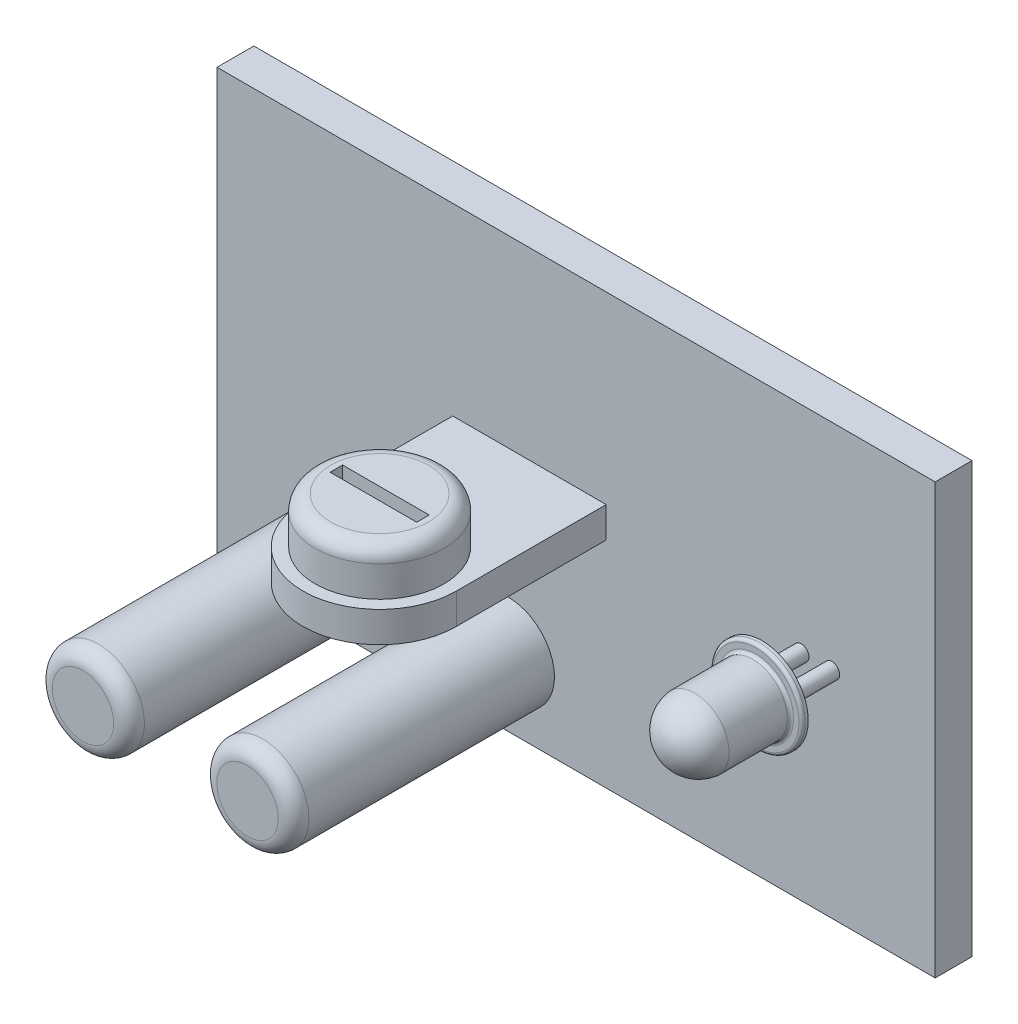
ISO-10303-21;
HEADER;
FILE_DESCRIPTION(('STEP AP214'),'2;1');
FILE_NAME('part.step','',(''),(''),'','','');
FILE_SCHEMA(('AUTOMOTIVE_DESIGN { 1 0 10303 214 1 1 1 1 }'));
ENDSEC;
DATA;
#1=APPLICATION_CONTEXT('core data for automotive mechanical design processes');
#2=APPLICATION_PROTOCOL_DEFINITION('international standard','automotive_design',2000,#1);
#3=PRODUCT_CONTEXT('',#1,'mechanical');
#4=PRODUCT('Part','Part','',(#3));
#5=PRODUCT_RELATED_PRODUCT_CATEGORY('part','',(#4));
#6=PRODUCT_DEFINITION_FORMATION('','',#4);
#7=PRODUCT_DEFINITION_CONTEXT('part definition',#1,'design');
#8=PRODUCT_DEFINITION('design','',#6,#7);
#9=PRODUCT_DEFINITION_SHAPE('','',#8);
#10=(LENGTH_UNIT() NAMED_UNIT(*) SI_UNIT(.MILLI.,.METRE.));
#11=(NAMED_UNIT(*) PLANE_ANGLE_UNIT() SI_UNIT($,.RADIAN.));
#12=(NAMED_UNIT(*) SI_UNIT($,.STERADIAN.) SOLID_ANGLE_UNIT());
#13=UNCERTAINTY_MEASURE_WITH_UNIT(LENGTH_MEASURE(1.E-05),#10,'distance_accuracy_value','');
#14=(GEOMETRIC_REPRESENTATION_CONTEXT(3) GLOBAL_UNCERTAINTY_ASSIGNED_CONTEXT((#13)) GLOBAL_UNIT_ASSIGNED_CONTEXT((#10,
#11,#12)) REPRESENTATION_CONTEXT('',''));
#15=CARTESIAN_POINT('',(0.,0.,0.));
#16=DIRECTION('',(0.,0.,1.));
#17=DIRECTION('',(1.,0.,0.));
#18=AXIS2_PLACEMENT_3D('',#15,#16,#17);
#19=CARTESIAN_POINT('',(0.,14.,1.2));
#20=DIRECTION('',(0.,0.,-1.));
#21=DIRECTION('',(-1.,0.,0.));
#22=AXIS2_PLACEMENT_3D('',#19,#20,#21);
#23=PLANE('',#22);
#24=CARTESIAN_POINT('',(4.13384348840779,2.29242224592477,1.2));
#25=DIRECTION('',(0.,0.,-1.));
#26=DIRECTION('',(-1.,0.,0.));
#27=AXIS2_PLACEMENT_3D('',#24,#25,#26);
#28=CIRCLE('',#27,1.5);
#29=CARTESIAN_POINT('',(2.63384348840779,2.29242224592477,1.2));
#30=VERTEX_POINT('',#29);
#31=EDGE_CURVE('E262',#30,#30,#28,.F.);
#32=ORIENTED_EDGE('',*,*,#31,.F.);
#33=EDGE_LOOP('',(#32));
#34=FACE_BOUND('',#33,.T.);
#35=CARTESIAN_POINT('',(19.0373188078302,7.,1.2));
#36=DIRECTION('',(0.,0.,-1.));
#37=DIRECTION('',(-1.,0.,0.));
#38=AXIS2_PLACEMENT_3D('',#35,#36,#37);
#39=CIRCLE('',#38,0.25);
#40=CARTESIAN_POINT('',(18.7873188078302,7.,1.2));
#41=VERTEX_POINT('',#40);
#42=EDGE_CURVE('E235',#41,#41,#39,.F.);
#43=ORIENTED_EDGE('',*,*,#42,.F.);
#44=EDGE_LOOP('',(#43));
#45=FACE_BOUND('',#44,.T.);
#46=DIRECTION('',(0.,-1.,0.));
#47=VECTOR('',#46,1.);
#48=CARTESIAN_POINT('',(0.,0.,1.2));
#49=LINE('',#48,#47);
#50=CARTESIAN_POINT('',(0.,14.,1.2));
#51=VERTEX_POINT('',#50);
#52=CARTESIAN_POINT('',(0.,0.,1.2));
#53=VERTEX_POINT('',#52);
#54=EDGE_CURVE('E203',#51,#53,#49,.T.);
#55=ORIENTED_EDGE('',*,*,#54,.T.);
#56=DIRECTION('',(1.,0.,0.));
#57=VECTOR('',#56,1.);
#58=CARTESIAN_POINT('',(0.,0.,1.2));
#59=LINE('',#58,#57);
#60=CARTESIAN_POINT('',(23.4,0.,1.2));
#61=VERTEX_POINT('',#60);
#62=EDGE_CURVE('E206',#53,#61,#59,.T.);
#63=ORIENTED_EDGE('',*,*,#62,.T.);
#64=DIRECTION('',(0.,1.,0.));
#65=VECTOR('',#64,1.);
#66=CARTESIAN_POINT('',(23.4,0.,1.2));
#67=LINE('',#66,#65);
#68=CARTESIAN_POINT('',(23.4,14.,1.2));
#69=VERTEX_POINT('',#68);
#70=EDGE_CURVE('E209',#61,#69,#67,.T.);
#71=ORIENTED_EDGE('',*,*,#70,.T.);
#72=DIRECTION('',(-1.,0.,0.));
#73=VECTOR('',#72,1.);
#74=CARTESIAN_POINT('',(0.,14.,1.2));
#75=LINE('',#74,#73);
#76=EDGE_CURVE('E211',#69,#51,#75,.T.);
#77=ORIENTED_EDGE('',*,*,#76,.T.);
#78=EDGE_LOOP('',(#55,#63,#71,#77));
#79=FACE_BOUND('',#78,.T.);
#80=CARTESIAN_POINT('',(20.0373188078302,7.,1.2));
#81=DIRECTION('',(0.,0.,-1.));
#82=DIRECTION('',(-1.,0.,0.));
#83=AXIS2_PLACEMENT_3D('',#80,#81,#82);
#84=CIRCLE('',#83,0.25);
#85=CARTESIAN_POINT('',(19.7873188078302,7.,1.2));
#86=VERTEX_POINT('',#85);
#87=EDGE_CURVE('E232',#86,#86,#84,.F.);
#88=ORIENTED_EDGE('',*,*,#87,.F.);
#89=EDGE_LOOP('',(#88));
#90=FACE_BOUND('',#89,.T.);
#91=DIRECTION('',(-1.,0.,0.));
#92=VECTOR('',#91,1.);
#93=CARTESIAN_POINT('',(12.6798034481771,8.,1.2));
#94=LINE('',#93,#92);
#95=CARTESIAN_POINT('',(12.6798034481771,8.,1.2));
#96=VERTEX_POINT('',#95);
#97=CARTESIAN_POINT('',(7.67980344817706,8.,1.2));
#98=VERTEX_POINT('',#97);
#99=EDGE_CURVE('E166',#96,#98,#94,.T.);
#100=ORIENTED_EDGE('',*,*,#99,.F.);
#101=DIRECTION('',(0.,-1.,0.));
#102=VECTOR('',#101,1.);
#103=CARTESIAN_POINT('',(12.6798034481771,8.,1.2));
#104=LINE('',#103,#102);
#105=CARTESIAN_POINT('',(12.6798034481771,7.,1.2));
#106=VERTEX_POINT('',#105);
#107=EDGE_CURVE('E176',#96,#106,#104,.T.);
#108=ORIENTED_EDGE('',*,*,#107,.T.);
#109=DIRECTION('',(-1.,0.,0.));
#110=VECTOR('',#109,1.);
#111=CARTESIAN_POINT('',(12.6798034481771,7.,1.2));
#112=LINE('',#111,#110);
#113=CARTESIAN_POINT('',(7.67980344817706,7.,1.2));
#114=VERTEX_POINT('',#113);
#115=EDGE_CURVE('E162',#106,#114,#112,.T.);
#116=ORIENTED_EDGE('',*,*,#115,.T.);
#117=DIRECTION('',(0.,-1.,0.));
#118=VECTOR('',#117,1.);
#119=CARTESIAN_POINT('',(7.67980344817706,8.,1.2));
#120=LINE('',#119,#118);
#121=EDGE_CURVE('E61',#98,#114,#120,.T.);
#122=ORIENTED_EDGE('',*,*,#121,.F.);
#123=EDGE_LOOP('',(#100,#108,#116,#122));
#124=FACE_BOUND('',#123,.T.);
#125=CARTESIAN_POINT('',(9.49280276463912,2.29242224592477,1.2));
#126=DIRECTION('',(0.,0.,-1.));
#127=DIRECTION('',(-1.,0.,0.));
#128=AXIS2_PLACEMENT_3D('',#125,#126,#127);
#129=CIRCLE('',#128,1.5);
#130=CARTESIAN_POINT('',(7.99280276463912,2.29242224592477,1.2));
#131=VERTEX_POINT('',#130);
#132=EDGE_CURVE('E265',#131,#131,#129,.F.);
#133=ORIENTED_EDGE('',*,*,#132,.F.);
#134=EDGE_LOOP('',(#133));
#135=FACE_BOUND('',#134,.T.);
#136=ADVANCED_FACE('F38',(#34,#45,#79,#90,#124,#135),#23,.F.);
#137=CARTESIAN_POINT('',(10.1798034481771,8.,6.08140192088163));
#138=DIRECTION('',(0.,-1.,0.));
#139=DIRECTION('',(0.,0.,-1.));
#140=AXIS2_PLACEMENT_3D('',#137,#138,#139);
#141=PLANE('',#140);
#142=ORIENTED_EDGE('',*,*,#99,.T.);
#143=DIRECTION('',(0.,0.,1.));
#144=VECTOR('',#143,1.);
#145=CARTESIAN_POINT('',(7.67980344817706,8.,1.2));
#146=LINE('',#145,#144);
#147=CARTESIAN_POINT('',(7.67980344817706,8.,6.08140192088163));
#148=VERTEX_POINT('',#147);
#149=EDGE_CURVE('E169',#98,#148,#146,.T.);
#150=ORIENTED_EDGE('',*,*,#149,.T.);
#151=CARTESIAN_POINT('',(10.1798034481771,8.,6.08140192088163));
#152=DIRECTION('',(0.,1.,0.));
#153=DIRECTION('',(0.,0.,-1.));
#154=AXIS2_PLACEMENT_3D('',#151,#152,#153);
#155=CIRCLE('',#154,2.5);
#156=CARTESIAN_POINT('',(12.6798034481771,8.,6.08140192088163));
#157=VERTEX_POINT('',#156);
#158=EDGE_CURVE('E172',#148,#157,#155,.T.);
#159=ORIENTED_EDGE('',*,*,#158,.T.);
#160=DIRECTION('',(0.,0.,-1.));
#161=VECTOR('',#160,1.);
#162=CARTESIAN_POINT('',(12.6798034481771,8.,1.2));
#163=LINE('',#162,#161);
#164=EDGE_CURVE('E174',#157,#96,#163,.T.);
#165=ORIENTED_EDGE('',*,*,#164,.T.);
#166=EDGE_LOOP('',(#142,#150,#159,#165));
#167=FACE_BOUND('',#166,.T.);
#168=CARTESIAN_POINT('',(10.1798034481771,8.,6.08140192088163));
#169=DIRECTION('',(0.,-1.,0.));
#170=DIRECTION('',(0.,0.,-1.));
#171=AXIS2_PLACEMENT_3D('',#168,#169,#170);
#172=CIRCLE('',#171,2.09861460217062);
#173=CARTESIAN_POINT('',(10.1798034481771,8.,3.98278731871101));
#174=VERTEX_POINT('',#173);
#175=EDGE_CURVE('E253',#174,#174,#172,.F.);
#176=ORIENTED_EDGE('',*,*,#175,.F.);
#177=EDGE_LOOP('',(#176));
#178=FACE_BOUND('',#177,.T.);
#179=ADVANCED_FACE('F287',(#167,#178),#141,.F.);
#180=CARTESIAN_POINT('',(20.0373188078302,7.,3.2));
#181=DIRECTION('',(0.,0.,1.));
#182=DIRECTION('',(1.,0.,0.));
#183=AXIS2_PLACEMENT_3D('',#180,#181,#182);
#184=PLANE('',#183);
#185=CARTESIAN_POINT('',(19.5633125136962,7.,3.2));
#186=DIRECTION('',(0.,0.,1.));
#187=DIRECTION('',(1.,0.,0.));
#188=AXIS2_PLACEMENT_3D('',#185,#186,#187);
#189=CIRCLE('',#188,1.22176659636533);
#190=CARTESIAN_POINT('',(20.7850791100615,7.,3.2));
#191=VERTEX_POINT('',#190);
#192=EDGE_CURVE('E247',#191,#191,#189,.F.);
#193=ORIENTED_EDGE('',*,*,#192,.T.);
#194=EDGE_LOOP('',(#193));
#195=FACE_BOUND('',#194,.T.);
#196=CARTESIAN_POINT('',(19.5633125136962,7.,3.2));
#197=DIRECTION('',(0.,0.,1.));
#198=DIRECTION('',(1.,0.,0.));
#199=AXIS2_PLACEMENT_3D('',#196,#197,#198);
#200=CIRCLE('',#199,1.4);
#201=CARTESIAN_POINT('',(20.9633125136962,7.,3.2));
#202=VERTEX_POINT('',#201);
#203=EDGE_CURVE('E244',#202,#202,#200,.T.);
#204=ORIENTED_EDGE('',*,*,#203,.T.);
#205=EDGE_LOOP('',(#204));
#206=FACE_BOUND('',#205,.T.);
#207=ADVANCED_FACE('F293',(#195,#206),#184,.T.);
#208=CARTESIAN_POINT('',(20.0373188078302,7.,3.2));
#209=DIRECTION('',(0.,0.,-1.));
#210=DIRECTION('',(-1.,0.,0.));
#211=AXIS2_PLACEMENT_3D('',#208,#209,#210);
#212=CYLINDRICAL_SURFACE('',#211,0.25);
#213=ORIENTED_EDGE('',*,*,#87,.T.);
#214=EDGE_LOOP('',(#213));
#215=FACE_BOUND('',#214,.T.);
#216=CARTESIAN_POINT('',(20.0373188078302,7.,3.));
#217=DIRECTION('',(0.,0.,1.));
#218=DIRECTION('',(1.,0.,0.));
#219=AXIS2_PLACEMENT_3D('',#216,#217,#218);
#220=CIRCLE('',#219,0.25);
#221=CARTESIAN_POINT('',(20.2873188078302,7.,3.));
#222=VERTEX_POINT('',#221);
#223=EDGE_CURVE('E198',#222,#222,#220,.T.);
#224=ORIENTED_EDGE('',*,*,#223,.F.);
#225=EDGE_LOOP('',(#224));
#226=FACE_BOUND('',#225,.T.);
#227=ADVANCED_FACE('F300',(#215,#226),#212,.T.);
#228=CARTESIAN_POINT('',(19.0373188078302,7.,3.2));
#229=DIRECTION('',(0.,0.,-1.));
#230=DIRECTION('',(-1.,0.,0.));
#231=AXIS2_PLACEMENT_3D('',#228,#229,#230);
#232=CYLINDRICAL_SURFACE('',#231,0.25);
#233=ORIENTED_EDGE('',*,*,#42,.T.);
#234=EDGE_LOOP('',(#233));
#235=FACE_BOUND('',#234,.T.);
#236=CARTESIAN_POINT('',(19.0373188078302,7.,3.));
#237=DIRECTION('',(0.,0.,1.));
#238=DIRECTION('',(1.,0.,0.));
#239=AXIS2_PLACEMENT_3D('',#236,#237,#238);
#240=CIRCLE('',#239,0.25);
#241=CARTESIAN_POINT('',(19.2873188078302,7.,3.));
#242=VERTEX_POINT('',#241);
#243=EDGE_CURVE('E202',#242,#242,#240,.T.);
#244=ORIENTED_EDGE('',*,*,#243,.F.);
#245=EDGE_LOOP('',(#244));
#246=FACE_BOUND('',#245,.T.);
#247=ADVANCED_FACE('F322',(#235,#246),#232,.T.);
#248=CARTESIAN_POINT('',(0.,0.,1.2));
#249=DIRECTION('',(1.,0.,0.));
#250=DIRECTION('',(0.,0.,-1.));
#251=AXIS2_PLACEMENT_3D('',#248,#249,#250);
#252=PLANE('',#251);
#253=DIRECTION('',(0.,-1.,0.));
#254=VECTOR('',#253,1.);
#255=CARTESIAN_POINT('',(0.,0.,0.));
#256=LINE('',#255,#254);
#257=CARTESIAN_POINT('',(0.,14.,0.));
#258=VERTEX_POINT('',#257);
#259=CARTESIAN_POINT('',(0.,0.,0.));
#260=VERTEX_POINT('',#259);
#261=EDGE_CURVE('E197',#258,#260,#256,.T.);
#262=ORIENTED_EDGE('',*,*,#261,.T.);
#263=DIRECTION('',(0.,0.,-1.));
#264=VECTOR('',#263,1.);
#265=CARTESIAN_POINT('',(0.,0.,1.2));
#266=LINE('',#265,#264);
#267=EDGE_CURVE('E229',#53,#260,#266,.T.);
#268=ORIENTED_EDGE('',*,*,#267,.F.);
#269=ORIENTED_EDGE('',*,*,#54,.F.);
#270=DIRECTION('',(0.,0.,-1.));
#271=VECTOR('',#270,1.);
#272=CARTESIAN_POINT('',(0.,14.,1.2));
#273=LINE('',#272,#271);
#274=EDGE_CURVE('E213',#51,#258,#273,.T.);
#275=ORIENTED_EDGE('',*,*,#274,.T.);
#276=EDGE_LOOP('',(#262,#268,#269,#275));
#277=FACE_BOUND('',#276,.T.);
#278=ADVANCED_FACE('F318',(#277),#252,.F.);
#279=CARTESIAN_POINT('',(0.,0.,1.2));
#280=DIRECTION('',(0.,1.,0.));
#281=DIRECTION('',(0.,0.,1.));
#282=AXIS2_PLACEMENT_3D('',#279,#280,#281);
#283=PLANE('',#282);
#284=DIRECTION('',(1.,0.,0.));
#285=VECTOR('',#284,1.);
#286=CARTESIAN_POINT('',(0.,0.,0.));
#287=LINE('',#286,#285);
#288=CARTESIAN_POINT('',(23.4,0.,0.));
#289=VERTEX_POINT('',#288);
#290=EDGE_CURVE('E216',#260,#289,#287,.T.);
#291=ORIENTED_EDGE('',*,*,#290,.T.);
#292=DIRECTION('',(0.,0.,-1.));
#293=VECTOR('',#292,1.);
#294=CARTESIAN_POINT('',(23.4,0.,1.2));
#295=LINE('',#294,#293);
#296=EDGE_CURVE('E226',#61,#289,#295,.T.);
#297=ORIENTED_EDGE('',*,*,#296,.F.);
#298=ORIENTED_EDGE('',*,*,#62,.F.);
#299=ORIENTED_EDGE('',*,*,#267,.T.);
#300=EDGE_LOOP('',(#291,#297,#298,#299));
#301=FACE_BOUND('',#300,.T.);
#302=ADVANCED_FACE('F314',(#301),#283,.F.);
#303=CARTESIAN_POINT('',(23.4,0.,1.2));
#304=DIRECTION('',(-1.,0.,0.));
#305=DIRECTION('',(0.,-1.,0.));
#306=AXIS2_PLACEMENT_3D('',#303,#304,#305);
#307=PLANE('',#306);
#308=DIRECTION('',(0.,1.,0.));
#309=VECTOR('',#308,1.);
#310=CARTESIAN_POINT('',(23.4,0.,0.));
#311=LINE('',#310,#309);
#312=CARTESIAN_POINT('',(23.4,14.,0.));
#313=VERTEX_POINT('',#312);
#314=EDGE_CURVE('E218',#289,#313,#311,.T.);
#315=ORIENTED_EDGE('',*,*,#314,.T.);
#316=DIRECTION('',(0.,0.,-1.));
#317=VECTOR('',#316,1.);
#318=CARTESIAN_POINT('',(23.4,14.,1.2));
#319=LINE('',#318,#317);
#320=EDGE_CURVE('E223',#69,#313,#319,.T.);
#321=ORIENTED_EDGE('',*,*,#320,.F.);
#322=ORIENTED_EDGE('',*,*,#70,.F.);
#323=ORIENTED_EDGE('',*,*,#296,.T.);
#324=EDGE_LOOP('',(#315,#321,#322,#323));
#325=FACE_BOUND('',#324,.T.);
#326=ADVANCED_FACE('F310',(#325),#307,.F.);
#327=CARTESIAN_POINT('',(0.,14.,1.2));
#328=DIRECTION('',(0.,-1.,0.));
#329=DIRECTION('',(0.,0.,-1.));
#330=AXIS2_PLACEMENT_3D('',#327,#328,#329);
#331=PLANE('',#330);
#332=DIRECTION('',(-1.,0.,0.));
#333=VECTOR('',#332,1.);
#334=CARTESIAN_POINT('',(0.,14.,0.));
#335=LINE('',#334,#333);
#336=EDGE_CURVE('E207',#313,#258,#335,.T.);
#337=ORIENTED_EDGE('',*,*,#336,.T.);
#338=ORIENTED_EDGE('',*,*,#274,.F.);
#339=ORIENTED_EDGE('',*,*,#76,.F.);
#340=ORIENTED_EDGE('',*,*,#320,.T.);
#341=EDGE_LOOP('',(#337,#338,#339,#340));
#342=FACE_BOUND('',#341,.T.);
#343=ADVANCED_FACE('F306',(#342),#331,.F.);
#344=CARTESIAN_POINT('',(0.,14.,0.));
#345=DIRECTION('',(0.,0.,-1.));
#346=DIRECTION('',(-1.,0.,0.));
#347=AXIS2_PLACEMENT_3D('',#344,#345,#346);
#348=PLANE('',#347);
#349=ORIENTED_EDGE('',*,*,#261,.F.);
#350=ORIENTED_EDGE('',*,*,#336,.F.);
#351=ORIENTED_EDGE('',*,*,#314,.F.);
#352=ORIENTED_EDGE('',*,*,#290,.F.);
#353=EDGE_LOOP('',(#349,#350,#351,#352));
#354=FACE_BOUND('',#353,.T.);
#355=ADVANCED_FACE('F302',(#354),#348,.T.);
#356=CARTESIAN_POINT('',(19.5633125136962,7.,3.));
#357=DIRECTION('',(0.,0.,1.));
#358=DIRECTION('',(1.,0.,0.));
#359=AXIS2_PLACEMENT_3D('',#356,#357,#358);
#360=PLANE('',#359);
#361=ORIENTED_EDGE('',*,*,#243,.T.);
#362=EDGE_LOOP('',(#361));
#363=FACE_BOUND('',#362,.T.);
#364=CARTESIAN_POINT('',(19.5633125136962,7.,3.));
#365=DIRECTION('',(0.,0.,1.));
#366=DIRECTION('',(1.,0.,0.));
#367=AXIS2_PLACEMENT_3D('',#364,#365,#366);
#368=CIRCLE('',#367,1.5);
#369=CARTESIAN_POINT('',(21.0633125136962,7.,3.));
#370=VERTEX_POINT('',#369);
#371=EDGE_CURVE('E194',#370,#370,#368,.T.);
#372=ORIENTED_EDGE('',*,*,#371,.F.);
#373=EDGE_LOOP('',(#372));
#374=FACE_BOUND('',#373,.T.);
#375=ORIENTED_EDGE('',*,*,#223,.T.);
#376=EDGE_LOOP('',(#375));
#377=FACE_BOUND('',#376,.T.);
#378=ADVANCED_FACE('F305',(#363,#374,#377),#360,.F.);
#379=CARTESIAN_POINT('',(19.5633125136962,7.,3.2));
#380=DIRECTION('',(0.,0.,-1.));
#381=DIRECTION('',(-1.,0.,0.));
#382=AXIS2_PLACEMENT_3D('',#379,#380,#381);
#383=CYLINDRICAL_SURFACE('',#382,1.5);
#384=CARTESIAN_POINT('',(19.5633125136962,7.,3.1));
#385=DIRECTION('',(0.,0.,1.));
#386=DIRECTION('',(1.,0.,0.));
#387=AXIS2_PLACEMENT_3D('',#384,#385,#386);
#388=CIRCLE('',#387,1.5);
#389=CARTESIAN_POINT('',(21.0633125136962,7.,3.1));
#390=VERTEX_POINT('',#389);
#391=EDGE_CURVE('E250',#390,#390,#388,.F.);
#392=ORIENTED_EDGE('',*,*,#391,.T.);
#393=EDGE_LOOP('',(#392));
#394=FACE_BOUND('',#393,.T.);
#395=ORIENTED_EDGE('',*,*,#371,.T.);
#396=EDGE_LOOP('',(#395));
#397=FACE_BOUND('',#396,.T.);
#398=ADVANCED_FACE('F380',(#394,#397),#383,.T.);
#399=CARTESIAN_POINT('',(19.5633125136962,7.,5.2));
#400=DIRECTION('',(0.,0.,-1.));
#401=DIRECTION('',(-1.,0.,0.));
#402=AXIS2_PLACEMENT_3D('',#399,#400,#401);
#403=CYLINDRICAL_SURFACE('',#402,1.12176659636533);
#404=CARTESIAN_POINT('',(19.5633125136962,7.,3.3));
#405=DIRECTION('',(0.,0.,1.));
#406=DIRECTION('',(1.,0.,0.));
#407=AXIS2_PLACEMENT_3D('',#404,#405,#406);
#408=CIRCLE('',#407,1.12176659636533);
#409=CARTESIAN_POINT('',(20.6850791100615,7.,3.3));
#410=VERTEX_POINT('',#409);
#411=EDGE_CURVE('E201',#410,#410,#408,.T.);
#412=ORIENTED_EDGE('',*,*,#411,.T.);
#413=EDGE_LOOP('',(#412));
#414=FACE_BOUND('',#413,.T.);
#415=CARTESIAN_POINT('',(19.5633125136962,7.,5.2));
#416=DIRECTION('',(0.,0.,1.));
#417=DIRECTION('',(1.,0.,0.));
#418=AXIS2_PLACEMENT_3D('',#415,#416,#417);
#419=CIRCLE('',#418,1.12176659636533);
#420=CARTESIAN_POINT('',(20.6850791100615,7.,5.2));
#421=VERTEX_POINT('',#420);
#422=EDGE_CURVE('E193',#421,#421,#419,.T.);
#423=ORIENTED_EDGE('',*,*,#422,.F.);
#424=EDGE_LOOP('',(#423));
#425=FACE_BOUND('',#424,.T.);
#426=ADVANCED_FACE('F328',(#414,#425),#403,.T.);
#427=CARTESIAN_POINT('',(19.5633125136962,7.,5.07081985163947));
#428=DIRECTION('',(0.,0.,1.));
#429=DIRECTION('',(1.,0.,0.));
#430=AXIS2_PLACEMENT_3D('',#427,#428,#429);
#431=SPHERICAL_SURFACE('',#430,1.12918014836053);
#432=ORIENTED_EDGE('',*,*,#422,.T.);
#433=EDGE_LOOP('',(#432));
#434=FACE_BOUND('',#433,.T.);
#435=ADVANCED_FACE('F324',(#434),#431,.T.);
#436=CARTESIAN_POINT('',(19.5633125136962,7.,3.3));
#437=DIRECTION('',(0.,0.,1.));
#438=DIRECTION('',(1.,0.,0.));
#439=AXIS2_PLACEMENT_3D('',#436,#437,#438);
#440=TOROIDAL_SURFACE('',#439,1.22176659636533,0.1);
#441=ORIENTED_EDGE('',*,*,#192,.F.);
#442=EDGE_LOOP('',(#441));
#443=FACE_BOUND('',#442,.T.);
#444=ORIENTED_EDGE('',*,*,#411,.F.);
#445=EDGE_LOOP('',(#444));
#446=FACE_BOUND('',#445,.T.);
#447=ADVANCED_FACE('F327',(#443,#446),#440,.F.);
#448=CARTESIAN_POINT('',(19.5633125136962,7.,3.1));
#449=DIRECTION('',(0.,0.,1.));
#450=DIRECTION('',(1.,0.,0.));
#451=AXIS2_PLACEMENT_3D('',#448,#449,#450);
#452=TOROIDAL_SURFACE('',#451,1.4,0.1);
#453=ORIENTED_EDGE('',*,*,#391,.F.);
#454=EDGE_LOOP('',(#453));
#455=FACE_BOUND('',#454,.T.);
#456=ORIENTED_EDGE('',*,*,#203,.F.);
#457=EDGE_LOOP('',(#456));
#458=FACE_BOUND('',#457,.T.);
#459=ADVANCED_FACE('F332',(#455,#458),#452,.T.);
#460=CARTESIAN_POINT('',(7.67980344817706,8.,1.2));
#461=DIRECTION('',(1.,0.,0.));
#462=DIRECTION('',(0.,0.,-1.));
#463=AXIS2_PLACEMENT_3D('',#460,#461,#462);
#464=PLANE('',#463);
#465=DIRECTION('',(0.,0.,1.));
#466=VECTOR('',#465,1.);
#467=CARTESIAN_POINT('',(7.67980344817706,7.,1.2));
#468=LINE('',#467,#466);
#469=CARTESIAN_POINT('',(7.67980344817706,7.,6.08140192088163));
#470=VERTEX_POINT('',#469);
#471=EDGE_CURVE('E179',#114,#470,#468,.T.);
#472=ORIENTED_EDGE('',*,*,#471,.T.);
#473=DIRECTION('',(0.,-1.,0.));
#474=VECTOR('',#473,1.);
#475=CARTESIAN_POINT('',(7.67980344817706,8.,6.08140192088163));
#476=LINE('',#475,#474);
#477=EDGE_CURVE('E189',#148,#470,#476,.T.);
#478=ORIENTED_EDGE('',*,*,#477,.F.);
#479=ORIENTED_EDGE('',*,*,#149,.F.);
#480=ORIENTED_EDGE('',*,*,#121,.T.);
#481=EDGE_LOOP('',(#472,#478,#479,#480));
#482=FACE_BOUND('',#481,.T.);
#483=ADVANCED_FACE('F336',(#482),#464,.F.);
#484=CARTESIAN_POINT('',(10.1798034481771,8.,6.08140192088163));
#485=DIRECTION('',(0.,-1.,0.));
#486=DIRECTION('',(0.,0.,-1.));
#487=AXIS2_PLACEMENT_3D('',#484,#485,#486);
#488=CYLINDRICAL_SURFACE('',#487,2.5);
#489=CARTESIAN_POINT('',(10.1798034481771,7.,6.08140192088163));
#490=DIRECTION('',(0.,1.,0.));
#491=DIRECTION('',(0.,0.,-1.));
#492=AXIS2_PLACEMENT_3D('',#489,#490,#491);
#493=CIRCLE('',#492,2.5);
#494=CARTESIAN_POINT('',(12.6798034481771,7.,6.08140192088163));
#495=VERTEX_POINT('',#494);
#496=EDGE_CURVE('E181',#470,#495,#493,.T.);
#497=ORIENTED_EDGE('',*,*,#496,.T.);
#498=DIRECTION('',(0.,-1.,0.));
#499=VECTOR('',#498,1.);
#500=CARTESIAN_POINT('',(12.6798034481771,8.,6.08140192088163));
#501=LINE('',#500,#499);
#502=EDGE_CURVE('E186',#157,#495,#501,.T.);
#503=ORIENTED_EDGE('',*,*,#502,.F.);
#504=ORIENTED_EDGE('',*,*,#158,.F.);
#505=ORIENTED_EDGE('',*,*,#477,.T.);
#506=EDGE_LOOP('',(#497,#503,#504,#505));
#507=FACE_BOUND('',#506,.T.);
#508=ADVANCED_FACE('F371',(#507),#488,.T.);
#509=CARTESIAN_POINT('',(12.6798034481771,8.,1.2));
#510=DIRECTION('',(-1.,0.,0.));
#511=DIRECTION('',(0.,0.,1.));
#512=AXIS2_PLACEMENT_3D('',#509,#510,#511);
#513=PLANE('',#512);
#514=DIRECTION('',(0.,0.,-1.));
#515=VECTOR('',#514,1.);
#516=CARTESIAN_POINT('',(12.6798034481771,7.,1.2));
#517=LINE('',#516,#515);
#518=EDGE_CURVE('E170',#495,#106,#517,.T.);
#519=ORIENTED_EDGE('',*,*,#518,.T.);
#520=ORIENTED_EDGE('',*,*,#107,.F.);
#521=ORIENTED_EDGE('',*,*,#164,.F.);
#522=ORIENTED_EDGE('',*,*,#502,.T.);
#523=EDGE_LOOP('',(#519,#520,#521,#522));
#524=FACE_BOUND('',#523,.T.);
#525=ADVANCED_FACE('F365',(#524),#513,.F.);
#526=CARTESIAN_POINT('',(10.1798034481771,7.,6.08140192088163));
#527=DIRECTION('',(0.,-1.,0.));
#528=DIRECTION('',(0.,0.,-1.));
#529=AXIS2_PLACEMENT_3D('',#526,#527,#528);
#530=PLANE('',#529);
#531=ORIENTED_EDGE('',*,*,#115,.F.);
#532=ORIENTED_EDGE('',*,*,#518,.F.);
#533=ORIENTED_EDGE('',*,*,#496,.F.);
#534=ORIENTED_EDGE('',*,*,#471,.F.);
#535=EDGE_LOOP('',(#531,#532,#533,#534));
#536=FACE_BOUND('',#535,.T.);
#537=ADVANCED_FACE('F358',(#536),#530,.T.);
#538=CARTESIAN_POINT('',(10.1798034481771,9.5,6.08140192088163));
#539=DIRECTION('',(0.,-1.,0.));
#540=DIRECTION('',(0.,0.,-1.));
#541=AXIS2_PLACEMENT_3D('',#538,#539,#540);
#542=CYLINDRICAL_SURFACE('',#541,2.09861460217062);
#543=CARTESIAN_POINT('',(10.1798034481771,9.,6.08140192088163));
#544=DIRECTION('',(0.,1.,0.));
#545=DIRECTION('',(0.,0.,1.));
#546=AXIS2_PLACEMENT_3D('',#543,#544,#545);
#547=CIRCLE('',#546,2.09861460217062);
#548=CARTESIAN_POINT('',(10.1798034481771,9.,8.18001652305225));
#549=VERTEX_POINT('',#548);
#550=EDGE_CURVE('E259',#549,#549,#547,.F.);
#551=ORIENTED_EDGE('',*,*,#550,.T.);
#552=EDGE_LOOP('',(#551));
#553=FACE_BOUND('',#552,.T.);
#554=ORIENTED_EDGE('',*,*,#175,.T.);
#555=EDGE_LOOP('',(#554));
#556=FACE_BOUND('',#555,.T.);
#557=ADVANCED_FACE('F348',(#553,#556),#542,.T.);
#558=CARTESIAN_POINT('',(10.1798034481771,9.5,6.08140192088163));
#559=DIRECTION('',(0.,1.,0.));
#560=DIRECTION('',(0.,0.,1.));
#561=AXIS2_PLACEMENT_3D('',#558,#559,#560);
#562=PLANE('',#561);
#563=DIRECTION('',(0.,0.,-1.));
#564=VECTOR('',#563,1.);
#565=CARTESIAN_POINT('',(11.5903158153483,9.5,6.2847324188054));
#566=LINE('',#565,#564);
#567=CARTESIAN_POINT('',(11.5903158153483,9.5,6.2847324188054));
#568=VERTEX_POINT('',#567);
#569=CARTESIAN_POINT('',(11.5903158153483,9.5,5.87807142295786));
#570=VERTEX_POINT('',#569);
#571=EDGE_CURVE('E53',#568,#570,#566,.T.);
#572=ORIENTED_EDGE('',*,*,#571,.F.);
#573=DIRECTION('',(1.,0.,0.));
#574=VECTOR('',#573,1.);
#575=CARTESIAN_POINT('',(8.7692910810058,9.5,6.2847324188054));
#576=LINE('',#575,#574);
#577=CARTESIAN_POINT('',(8.7692910810058,9.5,6.2847324188054));
#578=VERTEX_POINT('',#577);
#579=EDGE_CURVE('E147',#578,#568,#576,.T.);
#580=ORIENTED_EDGE('',*,*,#579,.F.);
#581=DIRECTION('',(0.,0.,1.));
#582=VECTOR('',#581,1.);
#583=CARTESIAN_POINT('',(8.7692910810058,9.5,6.2847324188054));
#584=LINE('',#583,#582);
#585=CARTESIAN_POINT('',(8.7692910810058,9.5,5.87807142295786));
#586=VERTEX_POINT('',#585);
#587=EDGE_CURVE('E150',#586,#578,#584,.T.);
#588=ORIENTED_EDGE('',*,*,#587,.F.);
#589=DIRECTION('',(-1.,0.,0.));
#590=VECTOR('',#589,1.);
#591=CARTESIAN_POINT('',(8.7692910810058,9.5,5.87807142295786));
#592=LINE('',#591,#590);
#593=EDGE_CURVE('E156',#570,#586,#592,.T.);
#594=ORIENTED_EDGE('',*,*,#593,.F.);
#595=EDGE_LOOP('',(#572,#580,#588,#594));
#596=FACE_BOUND('',#595,.T.);
#597=CARTESIAN_POINT('',(10.1798034481771,9.5,6.08140192088163));
#598=DIRECTION('',(0.,1.,0.));
#599=DIRECTION('',(0.,0.,1.));
#600=AXIS2_PLACEMENT_3D('',#597,#598,#599);
#601=CIRCLE('',#600,1.59861460217061);
#602=CARTESIAN_POINT('',(10.1798034481771,9.5,7.68001652305225));
#603=VERTEX_POINT('',#602);
#604=EDGE_CURVE('E256',#603,#603,#601,.T.);
#605=ORIENTED_EDGE('',*,*,#604,.T.);
#606=EDGE_LOOP('',(#605));
#607=FACE_BOUND('',#606,.T.);
#608=ADVANCED_FACE('F340',(#596,#607),#562,.T.);
#609=CARTESIAN_POINT('',(10.1798034481771,9.,6.08140192088163));
#610=DIRECTION('',(0.,1.,0.));
#611=DIRECTION('',(0.,0.,1.));
#612=AXIS2_PLACEMENT_3D('',#609,#610,#611);
#613=TOROIDAL_SURFACE('',#612,1.59861460217061,0.5);
#614=ORIENTED_EDGE('',*,*,#550,.F.);
#615=EDGE_LOOP('',(#614));
#616=FACE_BOUND('',#615,.T.);
#617=ORIENTED_EDGE('',*,*,#604,.F.);
#618=EDGE_LOOP('',(#617));
#619=FACE_BOUND('',#618,.T.);
#620=ADVANCED_FACE('F338',(#616,#619),#613,.T.);
#621=CARTESIAN_POINT('',(11.5903158153483,9.,6.2847324188054));
#622=DIRECTION('',(1.,0.,0.));
#623=DIRECTION('',(0.,0.,-1.));
#624=AXIS2_PLACEMENT_3D('',#621,#622,#623);
#625=PLANE('',#624);
#626=ORIENTED_EDGE('',*,*,#571,.T.);
#627=DIRECTION('',(0.,1.,0.));
#628=VECTOR('',#627,1.);
#629=CARTESIAN_POINT('',(11.5903158153483,9.,5.87807142295786));
#630=LINE('',#629,#628);
#631=CARTESIAN_POINT('',(11.5903158153483,9.,5.87807142295786));
#632=VERTEX_POINT('',#631);
#633=EDGE_CURVE('E125',#632,#570,#630,.T.);
#634=ORIENTED_EDGE('',*,*,#633,.F.);
#635=DIRECTION('',(0.,0.,-1.));
#636=VECTOR('',#635,1.);
#637=CARTESIAN_POINT('',(11.5903158153483,9.,6.2847324188054));
#638=LINE('',#637,#636);
#639=CARTESIAN_POINT('',(11.5903158153483,9.,6.2847324188054));
#640=VERTEX_POINT('',#639);
#641=EDGE_CURVE('E129',#640,#632,#638,.T.);
#642=ORIENTED_EDGE('',*,*,#641,.F.);
#643=DIRECTION('',(0.,1.,0.));
#644=VECTOR('',#643,1.);
#645=CARTESIAN_POINT('',(11.5903158153483,9.,6.2847324188054));
#646=LINE('',#645,#644);
#647=EDGE_CURVE('E160',#640,#568,#646,.T.);
#648=ORIENTED_EDGE('',*,*,#647,.T.);
#649=EDGE_LOOP('',(#626,#634,#642,#648));
#650=FACE_BOUND('',#649,.T.);
#651=ADVANCED_FACE('F127',(#650),#625,.F.);
#652=CARTESIAN_POINT('',(8.7692910810058,9.,6.2847324188054));
#653=DIRECTION('',(0.,0.,1.));
#654=DIRECTION('',(1.,0.,0.));
#655=AXIS2_PLACEMENT_3D('',#652,#653,#654);
#656=PLANE('',#655);
#657=ORIENTED_EDGE('',*,*,#579,.T.);
#658=ORIENTED_EDGE('',*,*,#647,.F.);
#659=DIRECTION('',(1.,0.,0.));
#660=VECTOR('',#659,1.);
#661=CARTESIAN_POINT('',(8.7692910810058,9.,6.2847324188054));
#662=LINE('',#661,#660);
#663=CARTESIAN_POINT('',(8.7692910810058,9.,6.2847324188054));
#664=VERTEX_POINT('',#663);
#665=EDGE_CURVE('E135',#664,#640,#662,.T.);
#666=ORIENTED_EDGE('',*,*,#665,.F.);
#667=DIRECTION('',(0.,1.,0.));
#668=VECTOR('',#667,1.);
#669=CARTESIAN_POINT('',(8.7692910810058,9.,6.2847324188054));
#670=LINE('',#669,#668);
#671=EDGE_CURVE('E163',#664,#578,#670,.T.);
#672=ORIENTED_EDGE('',*,*,#671,.T.);
#673=EDGE_LOOP('',(#657,#658,#666,#672));
#674=FACE_BOUND('',#673,.T.);
#675=ADVANCED_FACE('F346',(#674),#656,.F.);
#676=CARTESIAN_POINT('',(8.7692910810058,9.,6.2847324188054));
#677=DIRECTION('',(-1.,0.,0.));
#678=DIRECTION('',(0.,0.,1.));
#679=AXIS2_PLACEMENT_3D('',#676,#677,#678);
#680=PLANE('',#679);
#681=ORIENTED_EDGE('',*,*,#587,.T.);
#682=ORIENTED_EDGE('',*,*,#671,.F.);
#683=DIRECTION('',(0.,0.,1.));
#684=VECTOR('',#683,1.);
#685=CARTESIAN_POINT('',(8.7692910810058,9.,6.2847324188054));
#686=LINE('',#685,#684);
#687=CARTESIAN_POINT('',(8.7692910810058,9.,5.87807142295786));
#688=VERTEX_POINT('',#687);
#689=EDGE_CURVE('E143',#688,#664,#686,.T.);
#690=ORIENTED_EDGE('',*,*,#689,.F.);
#691=DIRECTION('',(0.,1.,0.));
#692=VECTOR('',#691,1.);
#693=CARTESIAN_POINT('',(8.7692910810058,9.,5.87807142295786));
#694=LINE('',#693,#692);
#695=EDGE_CURVE('E134',#688,#586,#694,.T.);
#696=ORIENTED_EDGE('',*,*,#695,.T.);
#697=EDGE_LOOP('',(#681,#682,#690,#696));
#698=FACE_BOUND('',#697,.T.);
#699=ADVANCED_FACE('F437',(#698),#680,.F.);
#700=CARTESIAN_POINT('',(8.7692910810058,9.,5.87807142295786));
#701=DIRECTION('',(0.,0.,-1.));
#702=DIRECTION('',(-1.,0.,0.));
#703=AXIS2_PLACEMENT_3D('',#700,#701,#702);
#704=PLANE('',#703);
#705=ORIENTED_EDGE('',*,*,#593,.T.);
#706=ORIENTED_EDGE('',*,*,#695,.F.);
#707=DIRECTION('',(-1.,0.,0.));
#708=VECTOR('',#707,1.);
#709=CARTESIAN_POINT('',(8.7692910810058,9.,5.87807142295786));
#710=LINE('',#709,#708);
#711=EDGE_CURVE('E138',#632,#688,#710,.T.);
#712=ORIENTED_EDGE('',*,*,#711,.F.);
#713=ORIENTED_EDGE('',*,*,#633,.T.);
#714=EDGE_LOOP('',(#705,#706,#712,#713));
#715=FACE_BOUND('',#714,.T.);
#716=ADVANCED_FACE('F139',(#715),#704,.F.);
#717=CARTESIAN_POINT('',(11.5903158153483,9.,5.87807142295786));
#718=DIRECTION('',(0.,-1.,0.));
#719=DIRECTION('',(0.,0.,-1.));
#720=AXIS2_PLACEMENT_3D('',#717,#718,#719);
#721=PLANE('',#720);
#722=ORIENTED_EDGE('',*,*,#641,.T.);
#723=ORIENTED_EDGE('',*,*,#711,.T.);
#724=ORIENTED_EDGE('',*,*,#689,.T.);
#725=ORIENTED_EDGE('',*,*,#665,.T.);
#726=EDGE_LOOP('',(#722,#723,#724,#725));
#727=FACE_BOUND('',#726,.T.);
#728=ADVANCED_FACE('F145',(#727),#721,.F.);
#729=CARTESIAN_POINT('',(4.13384348840779,2.29242224592477,9.7));
#730=DIRECTION('',(0.,0.,-1.));
#731=DIRECTION('',(-1.,0.,0.));
#732=AXIS2_PLACEMENT_3D('',#729,#730,#731);
#733=CYLINDRICAL_SURFACE('',#732,1.5);
#734=CARTESIAN_POINT('',(4.13384348840779,2.29242224592477,9.2));
#735=DIRECTION('',(0.,0.,1.));
#736=DIRECTION('',(1.,0.,0.));
#737=AXIS2_PLACEMENT_3D('',#734,#735,#736);
#738=CIRCLE('',#737,1.5);
#739=CARTESIAN_POINT('',(5.63384348840779,2.29242224592477,9.2));
#740=VERTEX_POINT('',#739);
#741=EDGE_CURVE('E271',#740,#740,#738,.F.);
#742=ORIENTED_EDGE('',*,*,#741,.T.);
#743=EDGE_LOOP('',(#742));
#744=FACE_BOUND('',#743,.T.);
#745=ORIENTED_EDGE('',*,*,#31,.T.);
#746=EDGE_LOOP('',(#745));
#747=FACE_BOUND('',#746,.T.);
#748=ADVANCED_FACE('F426',(#744,#747),#733,.T.);
#749=CARTESIAN_POINT('',(4.13384348840779,2.29242224592477,9.7));
#750=DIRECTION('',(0.,0.,1.));
#751=DIRECTION('',(1.,0.,0.));
#752=AXIS2_PLACEMENT_3D('',#749,#750,#751);
#753=PLANE('',#752);
#754=CARTESIAN_POINT('',(4.13384348840779,2.29242224592477,9.7));
#755=DIRECTION('',(0.,0.,1.));
#756=DIRECTION('',(1.,0.,0.));
#757=AXIS2_PLACEMENT_3D('',#754,#755,#756);
#758=CIRCLE('',#757,1.);
#759=CARTESIAN_POINT('',(5.13384348840779,2.29242224592477,9.7));
#760=VERTEX_POINT('',#759);
#761=EDGE_CURVE('E268',#760,#760,#758,.T.);
#762=ORIENTED_EDGE('',*,*,#761,.T.);
#763=EDGE_LOOP('',(#762));
#764=FACE_BOUND('',#763,.T.);
#765=ADVANCED_FACE('F418',(#764),#753,.T.);
#766=CARTESIAN_POINT('',(9.49280276463912,2.29242224592477,9.7));
#767=DIRECTION('',(0.,0.,-1.));
#768=DIRECTION('',(-1.,0.,0.));
#769=AXIS2_PLACEMENT_3D('',#766,#767,#768);
#770=CYLINDRICAL_SURFACE('',#769,1.5);
#771=CARTESIAN_POINT('',(9.49280276463912,2.29242224592477,9.2));
#772=DIRECTION('',(0.,0.,1.));
#773=DIRECTION('',(1.,0.,0.));
#774=AXIS2_PLACEMENT_3D('',#771,#772,#773);
#775=CIRCLE('',#774,1.5);
#776=CARTESIAN_POINT('',(10.9928027646391,2.29242224592477,9.2));
#777=VERTEX_POINT('',#776);
#778=EDGE_CURVE('E11',#777,#777,#775,.F.);
#779=ORIENTED_EDGE('',*,*,#778,.T.);
#780=EDGE_LOOP('',(#779));
#781=FACE_BOUND('',#780,.T.);
#782=ORIENTED_EDGE('',*,*,#132,.T.);
#783=EDGE_LOOP('',(#782));
#784=FACE_BOUND('',#783,.T.);
#785=ADVANCED_FACE('F416',(#781,#784),#770,.T.);
#786=CARTESIAN_POINT('',(9.49280276463912,2.29242224592477,9.7));
#787=DIRECTION('',(0.,0.,1.));
#788=DIRECTION('',(1.,0.,0.));
#789=AXIS2_PLACEMENT_3D('',#786,#787,#788);
#790=PLANE('',#789);
#791=CARTESIAN_POINT('',(9.49280276463912,2.29242224592477,9.7));
#792=DIRECTION('',(0.,0.,1.));
#793=DIRECTION('',(1.,0.,0.));
#794=AXIS2_PLACEMENT_3D('',#791,#792,#793);
#795=CIRCLE('',#794,1.);
#796=CARTESIAN_POINT('',(10.4928027646391,2.29242224592477,9.7));
#797=VERTEX_POINT('',#796);
#798=EDGE_CURVE('E46',#797,#797,#795,.T.);
#799=ORIENTED_EDGE('',*,*,#798,.T.);
#800=EDGE_LOOP('',(#799));
#801=FACE_BOUND('',#800,.T.);
#802=ADVANCED_FACE('F276',(#801),#790,.T.);
#803=CARTESIAN_POINT('',(4.13384348840779,2.29242224592477,9.2));
#804=DIRECTION('',(0.,0.,1.));
#805=DIRECTION('',(1.,0.,0.));
#806=AXIS2_PLACEMENT_3D('',#803,#804,#805);
#807=TOROIDAL_SURFACE('',#806,1.,0.5);
#808=ORIENTED_EDGE('',*,*,#741,.F.);
#809=EDGE_LOOP('',(#808));
#810=FACE_BOUND('',#809,.T.);
#811=ORIENTED_EDGE('',*,*,#761,.F.);
#812=EDGE_LOOP('',(#811));
#813=FACE_BOUND('',#812,.T.);
#814=ADVANCED_FACE('F279',(#810,#813),#807,.T.);
#815=CARTESIAN_POINT('',(9.49280276463912,2.29242224592477,9.2));
#816=DIRECTION('',(0.,0.,1.));
#817=DIRECTION('',(1.,0.,0.));
#818=AXIS2_PLACEMENT_3D('',#815,#816,#817);
#819=TOROIDAL_SURFACE('',#818,1.,0.5);
#820=ORIENTED_EDGE('',*,*,#778,.F.);
#821=EDGE_LOOP('',(#820));
#822=FACE_BOUND('',#821,.T.);
#823=ORIENTED_EDGE('',*,*,#798,.F.);
#824=EDGE_LOOP('',(#823));
#825=FACE_BOUND('',#824,.T.);
#826=ADVANCED_FACE('F40',(#822,#825),#819,.T.);
#827=CLOSED_SHELL('',(#136,#179,#207,#227,#247,#278,#302,#326,#343,#355,#378,#398,#426,#435,
#447,#459,#483,#508,#525,#537,#557,#608,#620,#651,#675,#699,#716,#728,#748,#765,#785,#802,#814,#826));
#828=MANIFOLD_SOLID_BREP('B2',#827);
#829=ADVANCED_BREP_SHAPE_REPRESENTATION('',(#18,#828),#14);
#830=SHAPE_DEFINITION_REPRESENTATION(#9,#829);
ENDSEC;
END-ISO-10303-21;
